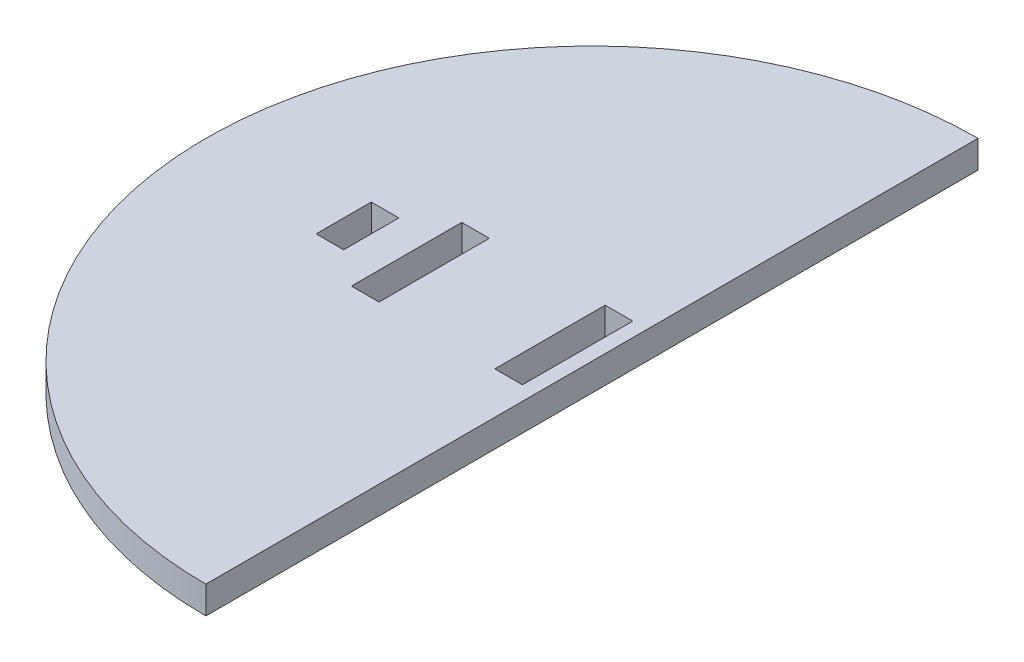
ISO-10303-21;
HEADER;
FILE_DESCRIPTION(('STEP AP214'),'2;1');
FILE_NAME('part.step','',(''),(''),'','','');
FILE_SCHEMA(('AUTOMOTIVE_DESIGN { 1 0 10303 214 1 1 1 1 }'));
ENDSEC;
DATA;
#1=APPLICATION_CONTEXT('core data for automotive mechanical design processes');
#2=APPLICATION_PROTOCOL_DEFINITION('international standard','automotive_design',2000,#1);
#3=PRODUCT_CONTEXT('',#1,'mechanical');
#4=PRODUCT('Part','Part','',(#3));
#5=PRODUCT_RELATED_PRODUCT_CATEGORY('part','',(#4));
#6=PRODUCT_DEFINITION_FORMATION('','',#4);
#7=PRODUCT_DEFINITION_CONTEXT('part definition',#1,'design');
#8=PRODUCT_DEFINITION('design','',#6,#7);
#9=PRODUCT_DEFINITION_SHAPE('','',#8);
#10=(LENGTH_UNIT() NAMED_UNIT(*) SI_UNIT(.MILLI.,.METRE.));
#11=(NAMED_UNIT(*) PLANE_ANGLE_UNIT() SI_UNIT($,.RADIAN.));
#12=(NAMED_UNIT(*) SI_UNIT($,.STERADIAN.) SOLID_ANGLE_UNIT());
#13=UNCERTAINTY_MEASURE_WITH_UNIT(LENGTH_MEASURE(1.E-05),#10,'distance_accuracy_value','');
#14=(GEOMETRIC_REPRESENTATION_CONTEXT(3) GLOBAL_UNCERTAINTY_ASSIGNED_CONTEXT((#13)) GLOBAL_UNIT_ASSIGNED_CONTEXT((#10,
#11,#12)) REPRESENTATION_CONTEXT('',''));
#15=CARTESIAN_POINT('',(0.,0.,0.));
#16=DIRECTION('',(0.,0.,1.));
#17=DIRECTION('',(1.,0.,0.));
#18=AXIS2_PLACEMENT_3D('',#15,#16,#17);
#19=CARTESIAN_POINT('',(0.,5.,0.));
#20=DIRECTION('',(0.,1.,0.));
#21=DIRECTION('',(0.,0.,1.));
#22=AXIS2_PLACEMENT_3D('',#19,#20,#21);
#23=PLANE('',#22);
#24=DIRECTION('',(1.,0.,0.));
#25=VECTOR('',#24,1.);
#26=CARTESIAN_POINT('',(0.,5.,10.));
#27=LINE('',#26,#25);
#28=CARTESIAN_POINT('',(-7.59999999999999,5.,10.));
#29=VERTEX_POINT('',#28);
#30=CARTESIAN_POINT('',(-2.59999999999999,5.,10.));
#31=VERTEX_POINT('',#30);
#32=EDGE_CURVE('E177',#29,#31,#27,.T.);
#33=ORIENTED_EDGE('',*,*,#32,.F.);
#34=DIRECTION('',(0.,0.,1.));
#35=VECTOR('',#34,1.);
#36=CARTESIAN_POINT('',(-7.59999999999999,5.,0.));
#37=LINE('',#36,#35);
#38=CARTESIAN_POINT('',(-7.59999999999999,5.,-10.));
#39=VERTEX_POINT('',#38);
#40=EDGE_CURVE('E187',#39,#29,#37,.T.);
#41=ORIENTED_EDGE('',*,*,#40,.F.);
#42=DIRECTION('',(-1.,0.,0.));
#43=VECTOR('',#42,1.);
#44=CARTESIAN_POINT('',(0.,5.,-10.));
#45=LINE('',#44,#43);
#46=CARTESIAN_POINT('',(-2.59999999999999,5.,-10.));
#47=VERTEX_POINT('',#46);
#48=EDGE_CURVE('E184',#47,#39,#45,.T.);
#49=ORIENTED_EDGE('',*,*,#48,.F.);
#50=DIRECTION('',(0.,0.,-1.));
#51=VECTOR('',#50,1.);
#52=CARTESIAN_POINT('',(-2.59999999999999,5.,0.));
#53=LINE('',#52,#51);
#54=EDGE_CURVE('E181',#31,#47,#53,.T.);
#55=ORIENTED_EDGE('',*,*,#54,.F.);
#56=EDGE_LOOP('',(#33,#41,#49,#55));
#57=FACE_BOUND('',#56,.T.);
#58=DIRECTION('',(1.,0.,0.));
#59=VECTOR('',#58,1.);
#60=CARTESIAN_POINT('',(-45.0000000000005,5.,-5.));
#61=LINE('',#60,#59);
#62=CARTESIAN_POINT('',(-45.0000000000005,5.,-5.));
#63=VERTEX_POINT('',#62);
#64=CARTESIAN_POINT('',(-40.0000000000005,5.,-5.));
#65=VERTEX_POINT('',#64);
#66=EDGE_CURVE('E200',#63,#65,#61,.T.);
#67=ORIENTED_EDGE('',*,*,#66,.T.);
#68=DIRECTION('',(0.,0.,-1.));
#69=VECTOR('',#68,1.);
#70=CARTESIAN_POINT('',(-40.0000000000005,5.,5.));
#71=LINE('',#70,#69);
#72=CARTESIAN_POINT('',(-40.0000000000005,5.,5.));
#73=VERTEX_POINT('',#72);
#74=EDGE_CURVE('E203',#73,#65,#71,.T.);
#75=ORIENTED_EDGE('',*,*,#74,.F.);
#76=DIRECTION('',(1.,0.,0.));
#77=VECTOR('',#76,1.);
#78=CARTESIAN_POINT('',(-45.0000000000005,5.,5.));
#79=LINE('',#78,#77);
#80=CARTESIAN_POINT('',(-45.0000000000005,5.,5.));
#81=VERTEX_POINT('',#80);
#82=EDGE_CURVE('E206',#81,#73,#79,.T.);
#83=ORIENTED_EDGE('',*,*,#82,.F.);
#84=DIRECTION('',(0.,0.,-1.));
#85=VECTOR('',#84,1.);
#86=CARTESIAN_POINT('',(-45.0000000000005,5.,5.));
#87=LINE('',#86,#85);
#88=EDGE_CURVE('E209',#81,#63,#87,.T.);
#89=ORIENTED_EDGE('',*,*,#88,.T.);
#90=EDGE_LOOP('',(#67,#75,#83,#89));
#91=FACE_BOUND('',#90,.T.);
#92=DIRECTION('',(0.,0.,1.));
#93=VECTOR('',#92,1.);
#94=CARTESIAN_POINT('',(-5.11743425413158E-13,5.,-70.));
#95=LINE('',#94,#93);
#96=CARTESIAN_POINT('',(-4.88807387438039E-13,5.,-70.));
#97=VERTEX_POINT('',#96);
#98=CARTESIAN_POINT('',(0.,5.,70.));
#99=VERTEX_POINT('',#98);
#100=EDGE_CURVE('E231',#97,#99,#95,.T.);
#101=ORIENTED_EDGE('',*,*,#100,.F.);
#102=CARTESIAN_POINT('',(0.,5.,0.));
#103=DIRECTION('',(0.,1.,0.));
#104=DIRECTION('',(0.,0.,1.));
#105=AXIS2_PLACEMENT_3D('',#102,#103,#104);
#106=CIRCLE('',#105,70.);
#107=EDGE_CURVE('E234',#97,#99,#106,.T.);
#108=ORIENTED_EDGE('',*,*,#107,.T.);
#109=EDGE_LOOP('',(#101,#108));
#110=FACE_BOUND('',#109,.T.);
#111=DIRECTION('',(-1.,0.,0.));
#112=VECTOR('',#111,1.);
#113=CARTESIAN_POINT('',(0.,5.,-9.99999999999999));
#114=LINE('',#113,#112);
#115=CARTESIAN_POINT('',(-28.6,5.,-9.99999999999999));
#116=VERTEX_POINT('',#115);
#117=CARTESIAN_POINT('',(-33.6,5.,-9.99999999999999));
#118=VERTEX_POINT('',#117);
#119=EDGE_CURVE('E165',#116,#118,#114,.T.);
#120=ORIENTED_EDGE('',*,*,#119,.F.);
#121=DIRECTION('',(0.,0.,1.));
#122=VECTOR('',#121,1.);
#123=CARTESIAN_POINT('',(-28.6,5.,0.));
#124=LINE('',#123,#122);
#125=CARTESIAN_POINT('',(-28.6,5.,10.));
#126=VERTEX_POINT('',#125);
#127=EDGE_CURVE('E68',#116,#126,#124,.T.);
#128=ORIENTED_EDGE('',*,*,#127,.T.);
#129=DIRECTION('',(1.,0.,0.));
#130=VECTOR('',#129,1.);
#131=CARTESIAN_POINT('',(0.,5.,10.));
#132=LINE('',#131,#130);
#133=CARTESIAN_POINT('',(-33.6,5.,10.));
#134=VERTEX_POINT('',#133);
#135=EDGE_CURVE('E170',#134,#126,#132,.T.);
#136=ORIENTED_EDGE('',*,*,#135,.F.);
#137=DIRECTION('',(0.,0.,1.));
#138=VECTOR('',#137,1.);
#139=CARTESIAN_POINT('',(-33.6,5.,0.));
#140=LINE('',#139,#138);
#141=EDGE_CURVE('E156',#118,#134,#140,.T.);
#142=ORIENTED_EDGE('',*,*,#141,.F.);
#143=EDGE_LOOP('',(#120,#128,#136,#142));
#144=FACE_BOUND('',#143,.T.);
#145=ADVANCED_FACE('F53',(#57,#91,#110,#144),#23,.T.);
#146=CARTESIAN_POINT('',(0.,0.,0.));
#147=DIRECTION('',(0.,1.,0.));
#148=DIRECTION('',(0.,0.,1.));
#149=AXIS2_PLACEMENT_3D('',#146,#147,#148);
#150=PLANE('',#149);
#151=DIRECTION('',(0.,0.,1.));
#152=VECTOR('',#151,1.);
#153=CARTESIAN_POINT('',(-5.11743425413158E-13,0.,-70.));
#154=LINE('',#153,#152);
#155=CARTESIAN_POINT('',(-4.88807387438039E-13,0.,-70.));
#156=VERTEX_POINT('',#155);
#157=CARTESIAN_POINT('',(0.,0.,70.));
#158=VERTEX_POINT('',#157);
#159=EDGE_CURVE('E224',#156,#158,#154,.T.);
#160=ORIENTED_EDGE('',*,*,#159,.T.);
#161=CARTESIAN_POINT('',(0.,0.,0.));
#162=DIRECTION('',(0.,1.,0.));
#163=DIRECTION('',(0.,0.,1.));
#164=AXIS2_PLACEMENT_3D('',#161,#162,#163);
#165=CIRCLE('',#164,70.);
#166=EDGE_CURVE('E235',#156,#158,#165,.T.);
#167=ORIENTED_EDGE('',*,*,#166,.F.);
#168=EDGE_LOOP('',(#160,#167));
#169=FACE_BOUND('',#168,.T.);
#170=DIRECTION('',(0.,0.,-1.));
#171=VECTOR('',#170,1.);
#172=CARTESIAN_POINT('',(-40.0000000000005,0.,5.));
#173=LINE('',#172,#171);
#174=CARTESIAN_POINT('',(-40.0000000000005,0.,5.));
#175=VERTEX_POINT('',#174);
#176=CARTESIAN_POINT('',(-40.0000000000005,0.,-5.));
#177=VERTEX_POINT('',#176);
#178=EDGE_CURVE('E214',#175,#177,#173,.T.);
#179=ORIENTED_EDGE('',*,*,#178,.T.);
#180=DIRECTION('',(1.,0.,0.));
#181=VECTOR('',#180,1.);
#182=CARTESIAN_POINT('',(-45.0000000000005,0.,-5.));
#183=LINE('',#182,#181);
#184=CARTESIAN_POINT('',(-45.0000000000005,0.,-5.));
#185=VERTEX_POINT('',#184);
#186=EDGE_CURVE('E193',#185,#177,#183,.T.);
#187=ORIENTED_EDGE('',*,*,#186,.F.);
#188=DIRECTION('',(0.,0.,-1.));
#189=VECTOR('',#188,1.);
#190=CARTESIAN_POINT('',(-45.0000000000005,0.,5.));
#191=LINE('',#190,#189);
#192=CARTESIAN_POINT('',(-45.0000000000005,0.,5.));
#193=VERTEX_POINT('',#192);
#194=EDGE_CURVE('E204',#193,#185,#191,.T.);
#195=ORIENTED_EDGE('',*,*,#194,.F.);
#196=DIRECTION('',(1.,0.,0.));
#197=VECTOR('',#196,1.);
#198=CARTESIAN_POINT('',(-45.0000000000005,0.,5.));
#199=LINE('',#198,#197);
#200=EDGE_CURVE('E217',#193,#175,#199,.T.);
#201=ORIENTED_EDGE('',*,*,#200,.T.);
#202=EDGE_LOOP('',(#179,#187,#195,#201));
#203=FACE_BOUND('',#202,.T.);
#204=DIRECTION('',(0.,0.,1.));
#205=VECTOR('',#204,1.);
#206=CARTESIAN_POINT('',(-7.59999999999999,0.,0.));
#207=LINE('',#206,#205);
#208=CARTESIAN_POINT('',(-7.59999999999999,0.,-10.));
#209=VERTEX_POINT('',#208);
#210=CARTESIAN_POINT('',(-7.59999999999999,0.,10.));
#211=VERTEX_POINT('',#210);
#212=EDGE_CURVE('E251',#209,#211,#207,.T.);
#213=ORIENTED_EDGE('',*,*,#212,.T.);
#214=DIRECTION('',(1.,0.,0.));
#215=VECTOR('',#214,1.);
#216=CARTESIAN_POINT('',(0.,0.,10.));
#217=LINE('',#216,#215);
#218=CARTESIAN_POINT('',(-2.59999999999999,0.,10.));
#219=VERTEX_POINT('',#218);
#220=EDGE_CURVE('E254',#211,#219,#217,.T.);
#221=ORIENTED_EDGE('',*,*,#220,.T.);
#222=DIRECTION('',(0.,0.,-1.));
#223=VECTOR('',#222,1.);
#224=CARTESIAN_POINT('',(-2.59999999999999,0.,0.));
#225=LINE('',#224,#223);
#226=CARTESIAN_POINT('',(-2.59999999999999,0.,-10.));
#227=VERTEX_POINT('',#226);
#228=EDGE_CURVE('E244',#219,#227,#225,.T.);
#229=ORIENTED_EDGE('',*,*,#228,.T.);
#230=DIRECTION('',(-1.,0.,0.));
#231=VECTOR('',#230,1.);
#232=CARTESIAN_POINT('',(0.,0.,-10.));
#233=LINE('',#232,#231);
#234=EDGE_CURVE('E248',#227,#209,#233,.T.);
#235=ORIENTED_EDGE('',*,*,#234,.T.);
#236=EDGE_LOOP('',(#213,#221,#229,#235));
#237=FACE_BOUND('',#236,.T.);
#238=DIRECTION('',(0.,0.,1.));
#239=VECTOR('',#238,1.);
#240=CARTESIAN_POINT('',(-28.6,0.,0.));
#241=LINE('',#240,#239);
#242=CARTESIAN_POINT('',(-28.6,0.,-9.99999999999999));
#243=VERTEX_POINT('',#242);
#244=CARTESIAN_POINT('',(-28.6,0.,10.));
#245=VERTEX_POINT('',#244);
#246=EDGE_CURVE('E12',#243,#245,#241,.T.);
#247=ORIENTED_EDGE('',*,*,#246,.F.);
#248=DIRECTION('',(-1.,0.,0.));
#249=VECTOR('',#248,1.);
#250=CARTESIAN_POINT('',(0.,0.,-9.99999999999999));
#251=LINE('',#250,#249);
#252=CARTESIAN_POINT('',(-33.6,0.,-9.99999999999999));
#253=VERTEX_POINT('',#252);
#254=EDGE_CURVE('E257',#243,#253,#251,.T.);
#255=ORIENTED_EDGE('',*,*,#254,.T.);
#256=DIRECTION('',(0.,0.,1.));
#257=VECTOR('',#256,1.);
#258=CARTESIAN_POINT('',(-33.6,0.,0.));
#259=LINE('',#258,#257);
#260=CARTESIAN_POINT('',(-33.6,0.,10.));
#261=VERTEX_POINT('',#260);
#262=EDGE_CURVE('E159',#253,#261,#259,.T.);
#263=ORIENTED_EDGE('',*,*,#262,.T.);
#264=DIRECTION('',(1.,0.,0.));
#265=VECTOR('',#264,1.);
#266=CARTESIAN_POINT('',(0.,0.,10.));
#267=LINE('',#266,#265);
#268=EDGE_CURVE('E61',#261,#245,#267,.T.);
#269=ORIENTED_EDGE('',*,*,#268,.T.);
#270=EDGE_LOOP('',(#247,#255,#263,#269));
#271=FACE_BOUND('',#270,.T.);
#272=ADVANCED_FACE('F262',(#169,#203,#237,#271),#150,.F.);
#273=CARTESIAN_POINT('',(-5.11743425413158E-13,5.,-70.));
#274=DIRECTION('',(1.,0.,0.));
#275=DIRECTION('',(0.,0.,-1.));
#276=AXIS2_PLACEMENT_3D('',#273,#274,#275);
#277=PLANE('',#276);
#278=ORIENTED_EDGE('',*,*,#159,.F.);
#279=DIRECTION('',(0.,-1.,0.));
#280=VECTOR('',#279,1.);
#281=CARTESIAN_POINT('',(-4.88807387438039E-13,5.,-70.));
#282=LINE('',#281,#280);
#283=EDGE_CURVE('E242',#97,#156,#282,.T.);
#284=ORIENTED_EDGE('',*,*,#283,.F.);
#285=ORIENTED_EDGE('',*,*,#100,.T.);
#286=DIRECTION('',(0.,-1.,0.));
#287=VECTOR('',#286,1.);
#288=CARTESIAN_POINT('',(0.,5.,70.));
#289=LINE('',#288,#287);
#290=EDGE_CURVE('E237',#99,#158,#289,.T.);
#291=ORIENTED_EDGE('',*,*,#290,.T.);
#292=EDGE_LOOP('',(#278,#284,#285,#291));
#293=FACE_BOUND('',#292,.T.);
#294=ADVANCED_FACE('F55',(#293),#277,.T.);
#295=CARTESIAN_POINT('',(0.,5.,0.));
#296=DIRECTION('',(0.,-1.,0.));
#297=DIRECTION('',(0.,0.,-1.));
#298=AXIS2_PLACEMENT_3D('',#295,#296,#297);
#299=CYLINDRICAL_SURFACE('',#298,70.);
#300=ORIENTED_EDGE('',*,*,#166,.T.);
#301=ORIENTED_EDGE('',*,*,#290,.F.);
#302=ORIENTED_EDGE('',*,*,#107,.F.);
#303=ORIENTED_EDGE('',*,*,#283,.T.);
#304=EDGE_LOOP('',(#300,#301,#302,#303));
#305=FACE_BOUND('',#304,.T.);
#306=ADVANCED_FACE('F295',(#305),#299,.T.);
#307=CARTESIAN_POINT('',(-45.0000000000005,5.,-5.));
#308=DIRECTION('',(0.,0.,-1.));
#309=DIRECTION('',(-1.,0.,0.));
#310=AXIS2_PLACEMENT_3D('',#307,#308,#309);
#311=PLANE('',#310);
#312=ORIENTED_EDGE('',*,*,#186,.T.);
#313=DIRECTION('',(0.,-1.,0.));
#314=VECTOR('',#313,1.);
#315=CARTESIAN_POINT('',(-40.0000000000005,5.,-5.));
#316=LINE('',#315,#314);
#317=EDGE_CURVE('E212',#65,#177,#316,.T.);
#318=ORIENTED_EDGE('',*,*,#317,.F.);
#319=ORIENTED_EDGE('',*,*,#66,.F.);
#320=DIRECTION('',(0.,-1.,0.));
#321=VECTOR('',#320,1.);
#322=CARTESIAN_POINT('',(-45.0000000000005,5.,-5.));
#323=LINE('',#322,#321);
#324=EDGE_CURVE('E222',#63,#185,#323,.T.);
#325=ORIENTED_EDGE('',*,*,#324,.T.);
#326=EDGE_LOOP('',(#312,#318,#319,#325));
#327=FACE_BOUND('',#326,.T.);
#328=ADVANCED_FACE('F293',(#327),#311,.F.);
#329=CARTESIAN_POINT('',(-45.0000000000005,5.,5.));
#330=DIRECTION('',(-1.,0.,0.));
#331=DIRECTION('',(0.,0.,1.));
#332=AXIS2_PLACEMENT_3D('',#329,#330,#331);
#333=PLANE('',#332);
#334=ORIENTED_EDGE('',*,*,#194,.T.);
#335=ORIENTED_EDGE('',*,*,#324,.F.);
#336=ORIENTED_EDGE('',*,*,#88,.F.);
#337=DIRECTION('',(0.,-1.,0.));
#338=VECTOR('',#337,1.);
#339=CARTESIAN_POINT('',(-45.0000000000005,5.,5.));
#340=LINE('',#339,#338);
#341=EDGE_CURVE('E225',#81,#193,#340,.T.);
#342=ORIENTED_EDGE('',*,*,#341,.T.);
#343=EDGE_LOOP('',(#334,#335,#336,#342));
#344=FACE_BOUND('',#343,.T.);
#345=ADVANCED_FACE('F302',(#344),#333,.F.);
#346=CARTESIAN_POINT('',(-45.0000000000005,5.,5.));
#347=DIRECTION('',(0.,0.,-1.));
#348=DIRECTION('',(-1.,0.,0.));
#349=AXIS2_PLACEMENT_3D('',#346,#347,#348);
#350=PLANE('',#349);
#351=ORIENTED_EDGE('',*,*,#200,.F.);
#352=ORIENTED_EDGE('',*,*,#341,.F.);
#353=ORIENTED_EDGE('',*,*,#82,.T.);
#354=DIRECTION('',(0.,-1.,0.));
#355=VECTOR('',#354,1.);
#356=CARTESIAN_POINT('',(-40.0000000000005,5.,5.));
#357=LINE('',#356,#355);
#358=EDGE_CURVE('E227',#73,#175,#357,.T.);
#359=ORIENTED_EDGE('',*,*,#358,.T.);
#360=EDGE_LOOP('',(#351,#352,#353,#359));
#361=FACE_BOUND('',#360,.T.);
#362=ADVANCED_FACE('F334',(#361),#350,.T.);
#363=CARTESIAN_POINT('',(-40.0000000000005,5.,5.));
#364=DIRECTION('',(-1.,0.,0.));
#365=DIRECTION('',(0.,0.,1.));
#366=AXIS2_PLACEMENT_3D('',#363,#364,#365);
#367=PLANE('',#366);
#368=ORIENTED_EDGE('',*,*,#178,.F.);
#369=ORIENTED_EDGE('',*,*,#358,.F.);
#370=ORIENTED_EDGE('',*,*,#74,.T.);
#371=ORIENTED_EDGE('',*,*,#317,.T.);
#372=EDGE_LOOP('',(#368,#369,#370,#371));
#373=FACE_BOUND('',#372,.T.);
#374=ADVANCED_FACE('F328',(#373),#367,.T.);
#375=CARTESIAN_POINT('',(0.,-5.,10.));
#376=DIRECTION('',(0.,0.,1.));
#377=DIRECTION('',(1.,0.,0.));
#378=AXIS2_PLACEMENT_3D('',#375,#376,#377);
#379=PLANE('',#378);
#380=DIRECTION('',(0.,1.,0.));
#381=VECTOR('',#380,1.);
#382=CARTESIAN_POINT('',(-7.59999999999999,-5.,10.));
#383=LINE('',#382,#381);
#384=EDGE_CURVE('E191',#211,#29,#383,.T.);
#385=ORIENTED_EDGE('',*,*,#384,.T.);
#386=ORIENTED_EDGE('',*,*,#32,.T.);
#387=DIRECTION('',(0.,1.,0.));
#388=VECTOR('',#387,1.);
#389=CARTESIAN_POINT('',(-2.59999999999999,-5.,10.));
#390=LINE('',#389,#388);
#391=EDGE_CURVE('E190',#219,#31,#390,.T.);
#392=ORIENTED_EDGE('',*,*,#391,.F.);
#393=ORIENTED_EDGE('',*,*,#220,.F.);
#394=EDGE_LOOP('',(#385,#386,#392,#393));
#395=FACE_BOUND('',#394,.T.);
#396=ADVANCED_FACE('F326',(#395),#379,.F.);
#397=CARTESIAN_POINT('',(-7.59999999999999,-5.,0.));
#398=DIRECTION('',(-1.,0.,0.));
#399=DIRECTION('',(0.,0.,1.));
#400=AXIS2_PLACEMENT_3D('',#397,#398,#399);
#401=PLANE('',#400);
#402=DIRECTION('',(0.,1.,0.));
#403=VECTOR('',#402,1.);
#404=CARTESIAN_POINT('',(-7.59999999999999,-5.,-10.));
#405=LINE('',#404,#403);
#406=EDGE_CURVE('E194',#209,#39,#405,.T.);
#407=ORIENTED_EDGE('',*,*,#406,.T.);
#408=ORIENTED_EDGE('',*,*,#40,.T.);
#409=ORIENTED_EDGE('',*,*,#384,.F.);
#410=ORIENTED_EDGE('',*,*,#212,.F.);
#411=EDGE_LOOP('',(#407,#408,#409,#410));
#412=FACE_BOUND('',#411,.T.);
#413=ADVANCED_FACE('F319',(#412),#401,.F.);
#414=CARTESIAN_POINT('',(0.,-5.,-10.));
#415=DIRECTION('',(0.,0.,-1.));
#416=DIRECTION('',(-1.,0.,0.));
#417=AXIS2_PLACEMENT_3D('',#414,#415,#416);
#418=PLANE('',#417);
#419=DIRECTION('',(0.,1.,0.));
#420=VECTOR('',#419,1.);
#421=CARTESIAN_POINT('',(-2.59999999999999,-5.,-10.));
#422=LINE('',#421,#420);
#423=EDGE_CURVE('E196',#227,#47,#422,.T.);
#424=ORIENTED_EDGE('',*,*,#423,.T.);
#425=ORIENTED_EDGE('',*,*,#48,.T.);
#426=ORIENTED_EDGE('',*,*,#406,.F.);
#427=ORIENTED_EDGE('',*,*,#234,.F.);
#428=EDGE_LOOP('',(#424,#425,#426,#427));
#429=FACE_BOUND('',#428,.T.);
#430=ADVANCED_FACE('F276',(#429),#418,.F.);
#431=CARTESIAN_POINT('',(-2.59999999999999,-5.,0.));
#432=DIRECTION('',(1.,0.,0.));
#433=DIRECTION('',(0.,0.,-1.));
#434=AXIS2_PLACEMENT_3D('',#431,#432,#433);
#435=PLANE('',#434);
#436=ORIENTED_EDGE('',*,*,#391,.T.);
#437=ORIENTED_EDGE('',*,*,#54,.T.);
#438=ORIENTED_EDGE('',*,*,#423,.F.);
#439=ORIENTED_EDGE('',*,*,#228,.F.);
#440=EDGE_LOOP('',(#436,#437,#438,#439));
#441=FACE_BOUND('',#440,.T.);
#442=ADVANCED_FACE('F268',(#441),#435,.F.);
#443=CARTESIAN_POINT('',(-28.6,-5.,0.));
#444=DIRECTION('',(-1.,0.,0.));
#445=DIRECTION('',(0.,0.,1.));
#446=AXIS2_PLACEMENT_3D('',#443,#444,#445);
#447=PLANE('',#446);
#448=ORIENTED_EDGE('',*,*,#246,.T.);
#449=DIRECTION('',(0.,1.,0.));
#450=VECTOR('',#449,1.);
#451=CARTESIAN_POINT('',(-28.6,-5.,10.));
#452=LINE('',#451,#450);
#453=EDGE_CURVE('E175',#245,#126,#452,.T.);
#454=ORIENTED_EDGE('',*,*,#453,.T.);
#455=ORIENTED_EDGE('',*,*,#127,.F.);
#456=DIRECTION('',(0.,1.,0.));
#457=VECTOR('',#456,1.);
#458=CARTESIAN_POINT('',(-28.6,-5.,-9.99999999999999));
#459=LINE('',#458,#457);
#460=EDGE_CURVE('E162',#243,#116,#459,.T.);
#461=ORIENTED_EDGE('',*,*,#460,.F.);
#462=EDGE_LOOP('',(#448,#454,#455,#461));
#463=FACE_BOUND('',#462,.T.);
#464=ADVANCED_FACE('F266',(#463),#447,.T.);
#465=CARTESIAN_POINT('',(0.,-5.,10.));
#466=DIRECTION('',(0.,0.,1.));
#467=DIRECTION('',(1.,0.,0.));
#468=AXIS2_PLACEMENT_3D('',#465,#466,#467);
#469=PLANE('',#468);
#470=DIRECTION('',(0.,1.,0.));
#471=VECTOR('',#470,1.);
#472=CARTESIAN_POINT('',(-33.6,-5.,10.));
#473=LINE('',#472,#471);
#474=EDGE_CURVE('E161',#261,#134,#473,.T.);
#475=ORIENTED_EDGE('',*,*,#474,.T.);
#476=ORIENTED_EDGE('',*,*,#135,.T.);
#477=ORIENTED_EDGE('',*,*,#453,.F.);
#478=ORIENTED_EDGE('',*,*,#268,.F.);
#479=EDGE_LOOP('',(#475,#476,#477,#478));
#480=FACE_BOUND('',#479,.T.);
#481=ADVANCED_FACE('F265',(#480),#469,.F.);
#482=CARTESIAN_POINT('',(-33.6,-5.,0.));
#483=DIRECTION('',(-1.,0.,0.));
#484=DIRECTION('',(0.,0.,1.));
#485=AXIS2_PLACEMENT_3D('',#482,#483,#484);
#486=PLANE('',#485);
#487=DIRECTION('',(0.,1.,0.));
#488=VECTOR('',#487,1.);
#489=CARTESIAN_POINT('',(-33.6,-5.,-9.99999999999999));
#490=LINE('',#489,#488);
#491=EDGE_CURVE('E76',#253,#118,#490,.T.);
#492=ORIENTED_EDGE('',*,*,#491,.T.);
#493=ORIENTED_EDGE('',*,*,#141,.T.);
#494=ORIENTED_EDGE('',*,*,#474,.F.);
#495=ORIENTED_EDGE('',*,*,#262,.F.);
#496=EDGE_LOOP('',(#492,#493,#494,#495));
#497=FACE_BOUND('',#496,.T.);
#498=ADVANCED_FACE('F153',(#497),#486,.F.);
#499=CARTESIAN_POINT('',(0.,-5.,-9.99999999999999));
#500=DIRECTION('',(0.,0.,-1.));
#501=DIRECTION('',(-1.,0.,0.));
#502=AXIS2_PLACEMENT_3D('',#499,#500,#501);
#503=PLANE('',#502);
#504=ORIENTED_EDGE('',*,*,#460,.T.);
#505=ORIENTED_EDGE('',*,*,#119,.T.);
#506=ORIENTED_EDGE('',*,*,#491,.F.);
#507=ORIENTED_EDGE('',*,*,#254,.F.);
#508=EDGE_LOOP('',(#504,#505,#506,#507));
#509=FACE_BOUND('',#508,.T.);
#510=ADVANCED_FACE('F166',(#509),#503,.F.);
#511=CLOSED_SHELL('',(#145,#272,#294,#306,#328,#345,#362,#374,#396,#413,#430,#442,#464,#481,
#498,#510));
#512=MANIFOLD_SOLID_BREP('B2',#511);
#513=ADVANCED_BREP_SHAPE_REPRESENTATION('',(#18,#512),#14);
#514=SHAPE_DEFINITION_REPRESENTATION(#9,#513);
ENDSEC;
END-ISO-10303-21;
